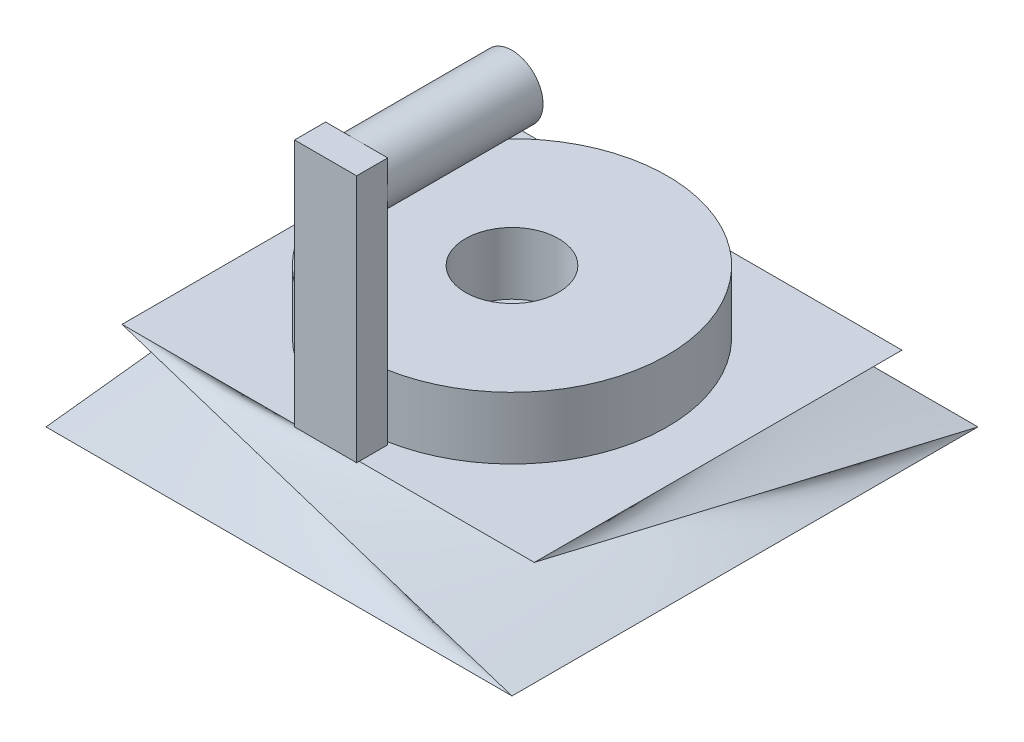
ISO-10303-21;
HEADER;
FILE_DESCRIPTION(('STEP AP214'),'2;1');
FILE_NAME('part.step','',(''),(''),'','','');
FILE_SCHEMA(('AUTOMOTIVE_DESIGN { 1 0 10303 214 1 1 1 1 }'));
ENDSEC;
DATA;
#1=APPLICATION_CONTEXT('core data for automotive mechanical design processes');
#2=APPLICATION_PROTOCOL_DEFINITION('international standard','automotive_design',2000,#1);
#3=PRODUCT_CONTEXT('',#1,'mechanical');
#4=PRODUCT('Part','Part','',(#3));
#5=PRODUCT_RELATED_PRODUCT_CATEGORY('part','',(#4));
#6=PRODUCT_DEFINITION_FORMATION('','',#4);
#7=PRODUCT_DEFINITION_CONTEXT('part definition',#1,'design');
#8=PRODUCT_DEFINITION('design','',#6,#7);
#9=PRODUCT_DEFINITION_SHAPE('','',#8);
#10=(LENGTH_UNIT() NAMED_UNIT(*) SI_UNIT(.MILLI.,.METRE.));
#11=(NAMED_UNIT(*) PLANE_ANGLE_UNIT() SI_UNIT($,.RADIAN.));
#12=(NAMED_UNIT(*) SI_UNIT($,.STERADIAN.) SOLID_ANGLE_UNIT());
#13=UNCERTAINTY_MEASURE_WITH_UNIT(LENGTH_MEASURE(1.E-05),#10,'distance_accuracy_value','');
#14=(GEOMETRIC_REPRESENTATION_CONTEXT(3) GLOBAL_UNCERTAINTY_ASSIGNED_CONTEXT((#13)) GLOBAL_UNIT_ASSIGNED_CONTEXT((#10,
#11,#12)) REPRESENTATION_CONTEXT('',''));
#15=CARTESIAN_POINT('',(0.,0.,0.));
#16=DIRECTION('',(0.,0.,1.));
#17=DIRECTION('',(1.,0.,0.));
#18=AXIS2_PLACEMENT_3D('',#15,#16,#17);
#19=CARTESIAN_POINT('',(0.,0.,50.));
#20=DIRECTION('',(0.,0.,1.));
#21=DIRECTION('',(1.,0.,0.));
#22=AXIS2_PLACEMENT_3D('',#19,#20,#21);
#23=PLANE('',#22);
#24=CARTESIAN_POINT('',(0.,70.,50.));
#25=DIRECTION('',(0.,0.,-1.));
#26=DIRECTION('',(-1.,0.,0.));
#27=AXIS2_PLACEMENT_3D('',#24,#25,#26);
#28=CIRCLE('',#27,10.);
#29=CARTESIAN_POINT('',(-10.,70.,50.));
#30=VERTEX_POINT('',#29);
#31=CARTESIAN_POINT('',(0.,80.,50.));
#32=VERTEX_POINT('',#31);
#33=EDGE_CURVE('E76',#30,#32,#28,.T.);
#34=ORIENTED_EDGE('',*,*,#33,.F.);
#35=DIRECTION('',(0.,-1.,0.));
#36=VECTOR('',#35,1.);
#37=CARTESIAN_POINT('',(-10.,80.,50.));
#38=LINE('',#37,#36);
#39=CARTESIAN_POINT('',(-10.,80.,50.));
#40=VERTEX_POINT('',#39);
#41=EDGE_CURVE('E118',#40,#30,#38,.T.);
#42=ORIENTED_EDGE('',*,*,#41,.F.);
#43=DIRECTION('',(-1.,0.,0.));
#44=VECTOR('',#43,1.);
#45=CARTESIAN_POINT('',(-10.,80.,50.));
#46=LINE('',#45,#44);
#47=EDGE_CURVE('E134',#32,#40,#46,.T.);
#48=ORIENTED_EDGE('',*,*,#47,.F.);
#49=EDGE_LOOP('',(#34,#42,#48));
#50=FACE_BOUND('',#49,.T.);
#51=ADVANCED_FACE('F65',(#50),#23,.F.);
#52=CARTESIAN_POINT('',(9.99999999999999,70.,50.));
#53=VERTEX_POINT('',#52);
#54=EDGE_CURVE('E13',#32,#53,#28,.T.);
#55=ORIENTED_EDGE('',*,*,#54,.F.);
#56=CARTESIAN_POINT('',(10.,80.,50.));
#57=VERTEX_POINT('',#56);
#58=EDGE_CURVE('E132',#57,#32,#46,.T.);
#59=ORIENTED_EDGE('',*,*,#58,.F.);
#60=DIRECTION('',(0.,1.,0.));
#61=VECTOR('',#60,1.);
#62=CARTESIAN_POINT('',(10.,80.,50.));
#63=LINE('',#62,#61);
#64=EDGE_CURVE('E155',#53,#57,#63,.T.);
#65=ORIENTED_EDGE('',*,*,#64,.F.);
#66=EDGE_LOOP('',(#55,#59,#65));
#67=FACE_BOUND('',#66,.T.);
#68=ADVANCED_FACE('F171',(#67),#23,.F.);
#69=CARTESIAN_POINT('',(10.,80.,60.));
#70=DIRECTION('',(-1.,0.,0.));
#71=DIRECTION('',(0.,-1.,0.));
#72=AXIS2_PLACEMENT_3D('',#69,#70,#71);
#73=PLANE('',#72);
#74=CARTESIAN_POINT('',(9.99999999999999,0.,50.));
#75=VERTEX_POINT('',#74);
#76=EDGE_CURVE('E152',#75,#53,#63,.T.);
#77=ORIENTED_EDGE('',*,*,#76,.T.);
#78=ORIENTED_EDGE('',*,*,#64,.T.);
#79=DIRECTION('',(0.,0.,-1.));
#80=VECTOR('',#79,1.);
#81=CARTESIAN_POINT('',(10.,80.,60.));
#82=LINE('',#81,#80);
#83=CARTESIAN_POINT('',(10.,80.,60.));
#84=VERTEX_POINT('',#83);
#85=EDGE_CURVE('E69',#84,#57,#82,.T.);
#86=ORIENTED_EDGE('',*,*,#85,.F.);
#87=DIRECTION('',(0.,1.,0.));
#88=VECTOR('',#87,1.);
#89=CARTESIAN_POINT('',(10.,80.,60.));
#90=LINE('',#89,#88);
#91=CARTESIAN_POINT('',(9.99999999999999,0.,60.));
#92=VERTEX_POINT('',#91);
#93=EDGE_CURVE('E142',#92,#84,#90,.T.);
#94=ORIENTED_EDGE('',*,*,#93,.F.);
#95=DIRECTION('',(0.,0.,-1.));
#96=VECTOR('',#95,1.);
#97=CARTESIAN_POINT('',(9.99999999999999,0.,60.));
#98=LINE('',#97,#96);
#99=EDGE_CURVE('E151',#92,#75,#98,.T.);
#100=ORIENTED_EDGE('',*,*,#99,.T.);
#101=EDGE_LOOP('',(#77,#78,#86,#94,#100));
#102=FACE_BOUND('',#101,.T.);
#103=ADVANCED_FACE('F67',(#102),#73,.F.);
#104=CARTESIAN_POINT('',(-10.,80.,60.));
#105=DIRECTION('',(0.,-1.,0.));
#106=DIRECTION('',(0.,0.,-1.));
#107=AXIS2_PLACEMENT_3D('',#104,#105,#106);
#108=PLANE('',#107);
#109=ORIENTED_EDGE('',*,*,#58,.T.);
#110=ORIENTED_EDGE('',*,*,#47,.T.);
#111=DIRECTION('',(0.,0.,-1.));
#112=VECTOR('',#111,1.);
#113=CARTESIAN_POINT('',(-10.,80.,60.));
#114=LINE('',#113,#112);
#115=CARTESIAN_POINT('',(-10.,80.,60.));
#116=VERTEX_POINT('',#115);
#117=EDGE_CURVE('E125',#116,#40,#114,.T.);
#118=ORIENTED_EDGE('',*,*,#117,.F.);
#119=DIRECTION('',(-1.,0.,0.));
#120=VECTOR('',#119,1.);
#121=CARTESIAN_POINT('',(-10.,80.,60.));
#122=LINE('',#121,#120);
#123=EDGE_CURVE('E145',#84,#116,#122,.T.);
#124=ORIENTED_EDGE('',*,*,#123,.F.);
#125=ORIENTED_EDGE('',*,*,#85,.T.);
#126=EDGE_LOOP('',(#109,#110,#118,#124,#125));
#127=FACE_BOUND('',#126,.T.);
#128=ADVANCED_FACE('F170',(#127),#108,.F.);
#129=CARTESIAN_POINT('',(-10.,80.,60.));
#130=DIRECTION('',(1.,0.,0.));
#131=DIRECTION('',(0.,1.,0.));
#132=AXIS2_PLACEMENT_3D('',#129,#130,#131);
#133=PLANE('',#132);
#134=ORIENTED_EDGE('',*,*,#41,.T.);
#135=CARTESIAN_POINT('',(-10.,0.,50.));
#136=VERTEX_POINT('',#135);
#137=EDGE_CURVE('E121',#30,#136,#38,.T.);
#138=ORIENTED_EDGE('',*,*,#137,.T.);
#139=DIRECTION('',(0.,0.,-1.));
#140=VECTOR('',#139,1.);
#141=CARTESIAN_POINT('',(-10.,0.,60.));
#142=LINE('',#141,#140);
#143=CARTESIAN_POINT('',(-10.,0.,60.));
#144=VERTEX_POINT('',#143);
#145=EDGE_CURVE('E160',#144,#136,#142,.T.);
#146=ORIENTED_EDGE('',*,*,#145,.F.);
#147=DIRECTION('',(0.,-1.,0.));
#148=VECTOR('',#147,1.);
#149=CARTESIAN_POINT('',(-10.,80.,60.));
#150=LINE('',#149,#148);
#151=EDGE_CURVE('E147',#116,#144,#150,.T.);
#152=ORIENTED_EDGE('',*,*,#151,.F.);
#153=ORIENTED_EDGE('',*,*,#117,.T.);
#154=EDGE_LOOP('',(#134,#138,#146,#152,#153));
#155=FACE_BOUND('',#154,.T.);
#156=ADVANCED_FACE('F119',(#155),#133,.F.);
#157=CARTESIAN_POINT('',(-10.,0.,60.));
#158=DIRECTION('',(0.,1.,0.));
#159=DIRECTION('',(0.,0.,1.));
#160=AXIS2_PLACEMENT_3D('',#157,#158,#159);
#161=PLANE('',#160);
#162=DIRECTION('',(1.,0.,0.));
#163=VECTOR('',#162,1.);
#164=CARTESIAN_POINT('',(-10.,0.,50.));
#165=LINE('',#164,#163);
#166=EDGE_CURVE('E128',#136,#75,#165,.T.);
#167=ORIENTED_EDGE('',*,*,#166,.T.);
#168=ORIENTED_EDGE('',*,*,#99,.F.);
#169=DIRECTION('',(1.,0.,0.));
#170=VECTOR('',#169,1.);
#171=CARTESIAN_POINT('',(-10.,0.,60.));
#172=LINE('',#171,#170);
#173=EDGE_CURVE('E149',#144,#92,#172,.T.);
#174=ORIENTED_EDGE('',*,*,#173,.F.);
#175=ORIENTED_EDGE('',*,*,#145,.T.);
#176=EDGE_LOOP('',(#167,#168,#174,#175));
#177=FACE_BOUND('',#176,.T.);
#178=ADVANCED_FACE('F163',(#177),#161,.F.);
#179=CARTESIAN_POINT('',(0.,0.,60.));
#180=DIRECTION('',(0.,0.,1.));
#181=DIRECTION('',(1.,0.,0.));
#182=AXIS2_PLACEMENT_3D('',#179,#180,#181);
#183=PLANE('',#182);
#184=ORIENTED_EDGE('',*,*,#93,.T.);
#185=ORIENTED_EDGE('',*,*,#123,.T.);
#186=ORIENTED_EDGE('',*,*,#151,.T.);
#187=ORIENTED_EDGE('',*,*,#173,.T.);
#188=EDGE_LOOP('',(#184,#185,#186,#187));
#189=FACE_BOUND('',#188,.T.);
#190=ADVANCED_FACE('F166',(#189),#183,.T.);
#191=EDGE_CURVE('E74',#53,#30,#28,.T.);
#192=ORIENTED_EDGE('',*,*,#191,.F.);
#193=ORIENTED_EDGE('',*,*,#76,.F.);
#194=ORIENTED_EDGE('',*,*,#166,.F.);
#195=ORIENTED_EDGE('',*,*,#137,.F.);
#196=EDGE_LOOP('',(#192,#193,#194,#195));
#197=FACE_BOUND('',#196,.T.);
#198=ADVANCED_FACE('F131',(#197),#23,.F.);
#199=CARTESIAN_POINT('',(0.,70.,0.));
#200=DIRECTION('',(0.,0.,1.));
#201=DIRECTION('',(1.,0.,0.));
#202=AXIS2_PLACEMENT_3D('',#199,#200,#201);
#203=CYLINDRICAL_SURFACE('',#202,10.);
#204=CARTESIAN_POINT('',(0.,70.,0.));
#205=DIRECTION('',(0.,0.,-1.));
#206=DIRECTION('',(-1.,0.,0.));
#207=AXIS2_PLACEMENT_3D('',#204,#205,#206);
#208=CIRCLE('',#207,10.);
#209=CARTESIAN_POINT('',(-10.,70.,0.));
#210=VERTEX_POINT('',#209);
#211=EDGE_CURVE('E137',#210,#210,#208,.T.);
#212=ORIENTED_EDGE('',*,*,#211,.F.);
#213=EDGE_LOOP('',(#212));
#214=FACE_BOUND('',#213,.T.);
#215=ORIENTED_EDGE('',*,*,#33,.T.);
#216=ORIENTED_EDGE('',*,*,#54,.T.);
#217=ORIENTED_EDGE('',*,*,#191,.T.);
#218=EDGE_LOOP('',(#215,#216,#217));
#219=FACE_BOUND('',#218,.T.);
#220=ADVANCED_FACE('F138',(#214,#219),#203,.T.);
#221=CARTESIAN_POINT('',(0.,70.,0.));
#222=DIRECTION('',(0.,0.,-1.));
#223=DIRECTION('',(-1.,0.,0.));
#224=AXIS2_PLACEMENT_3D('',#221,#222,#223);
#225=PLANE('',#224);
#226=ORIENTED_EDGE('',*,*,#211,.T.);
#227=EDGE_LOOP('',(#226));
#228=FACE_BOUND('',#227,.T.);
#229=ADVANCED_FACE('F190',(#228),#225,.T.);
#230=CLOSED_SHELL('',(#51,#68,#103,#128,#156,#178,#190,#198,#220,#229));
#231=MANIFOLD_SOLID_BREP('B2',#230);
#232=CARTESIAN_POINT('',(0.,20.,0.));
#233=DIRECTION('',(0.,1.,0.));
#234=DIRECTION('',(0.,0.,1.));
#235=AXIS2_PLACEMENT_3D('',#232,#233,#234);
#236=PLANE('',#235);
#237=CARTESIAN_POINT('',(0.,20.,0.));
#238=DIRECTION('',(0.,1.,0.));
#239=DIRECTION('',(0.,0.,1.));
#240=AXIS2_PLACEMENT_3D('',#237,#238,#239);
#241=CIRCLE('',#240,50.);
#242=CARTESIAN_POINT('',(0.,20.,50.));
#243=VERTEX_POINT('',#242);
#244=EDGE_CURVE('E63',#243,#243,#241,.T.);
#245=ORIENTED_EDGE('',*,*,#244,.T.);
#246=EDGE_LOOP('',(#245));
#247=FACE_BOUND('',#246,.T.);
#248=CARTESIAN_POINT('',(0.,20.,0.));
#249=DIRECTION('',(0.,1.,0.));
#250=DIRECTION('',(0.,0.,1.));
#251=AXIS2_PLACEMENT_3D('',#248,#249,#250);
#252=CIRCLE('',#251,15.);
#253=CARTESIAN_POINT('',(0.,20.,15.));
#254=VERTEX_POINT('',#253);
#255=EDGE_CURVE('E266',#254,#254,#252,.T.);
#256=ORIENTED_EDGE('',*,*,#255,.F.);
#257=EDGE_LOOP('',(#256));
#258=FACE_BOUND('',#257,.T.);
#259=ADVANCED_FACE('F256',(#247,#258),#236,.T.);
#260=CARTESIAN_POINT('',(0.,20.,0.));
#261=DIRECTION('',(0.,-1.,0.));
#262=DIRECTION('',(0.,0.,-1.));
#263=AXIS2_PLACEMENT_3D('',#260,#261,#262);
#264=CYLINDRICAL_SURFACE('',#263,50.);
#265=ORIENTED_EDGE('',*,*,#244,.F.);
#266=EDGE_LOOP('',(#265));
#267=FACE_BOUND('',#266,.T.);
#268=CARTESIAN_POINT('',(0.,0.,0.));
#269=DIRECTION('',(0.,1.,0.));
#270=DIRECTION('',(0.,0.,1.));
#271=AXIS2_PLACEMENT_3D('',#268,#269,#270);
#272=CIRCLE('',#271,50.);
#273=CARTESIAN_POINT('',(0.,0.,50.));
#274=VERTEX_POINT('',#273);
#275=EDGE_CURVE('E341',#274,#274,#272,.T.);
#276=ORIENTED_EDGE('',*,*,#275,.T.);
#277=EDGE_LOOP('',(#276));
#278=FACE_BOUND('',#277,.T.);
#279=ADVANCED_FACE('F258',(#267,#278),#264,.T.);
#280=CARTESIAN_POINT('',(0.,20.,0.));
#281=DIRECTION('',(0.,-1.,0.));
#282=DIRECTION('',(0.,0.,-1.));
#283=AXIS2_PLACEMENT_3D('',#280,#281,#282);
#284=CYLINDRICAL_SURFACE('',#283,15.);
#285=ORIENTED_EDGE('',*,*,#255,.T.);
#286=EDGE_LOOP('',(#285));
#287=FACE_BOUND('',#286,.T.);
#288=CARTESIAN_POINT('',(0.,0.,0.));
#289=DIRECTION('',(0.,1.,0.));
#290=DIRECTION('',(0.,0.,1.));
#291=AXIS2_PLACEMENT_3D('',#288,#289,#290);
#292=CIRCLE('',#291,15.);
#293=CARTESIAN_POINT('',(0.,0.,15.));
#294=VERTEX_POINT('',#293);
#295=EDGE_CURVE('E344',#294,#294,#292,.T.);
#296=ORIENTED_EDGE('',*,*,#295,.F.);
#297=EDGE_LOOP('',(#296));
#298=FACE_BOUND('',#297,.T.);
#299=ADVANCED_FACE('F373',(#287,#298),#284,.F.);
#300=CARTESIAN_POINT('',(0.,0.,0.));
#301=DIRECTION('',(0.,-1.,0.));
#302=DIRECTION('',(0.,0.,-1.));
#303=AXIS2_PLACEMENT_3D('',#300,#301,#302);
#304=PLANE('',#303);
#305=ORIENTED_EDGE('',*,*,#295,.T.);
#306=EDGE_LOOP('',(#305));
#307=FACE_BOUND('',#306,.T.);
#308=ADVANCED_FACE('F367',(#307),#304,.F.);
#309=CARTESIAN_POINT('',(0.,-25.,0.));
#310=DIRECTION('',(0.,-1.,0.));
#311=DIRECTION('',(0.,0.,-1.));
#312=AXIS2_PLACEMENT_3D('',#309,#310,#311);
#313=PLANE('',#312);
#314=DIRECTION('',(0.,0.,-1.));
#315=VECTOR('',#314,1.);
#316=CARTESIAN_POINT('',(-75.,-25.,-75.));
#317=LINE('',#316,#315);
#318=CARTESIAN_POINT('',(-75.,-25.,75.));
#319=VERTEX_POINT('',#318);
#320=CARTESIAN_POINT('',(-75.,-25.,-75.));
#321=VERTEX_POINT('',#320);
#322=EDGE_CURVE('E398',#319,#321,#317,.T.);
#323=ORIENTED_EDGE('',*,*,#322,.T.);
#324=DIRECTION('',(1.,0.,0.));
#325=VECTOR('',#324,1.);
#326=CARTESIAN_POINT('',(75.,-25.,-75.));
#327=LINE('',#326,#325);
#328=CARTESIAN_POINT('',(75.,-25.,-75.));
#329=VERTEX_POINT('',#328);
#330=EDGE_CURVE('E281',#321,#329,#327,.T.);
#331=ORIENTED_EDGE('',*,*,#330,.T.);
#332=DIRECTION('',(0.,0.,1.));
#333=VECTOR('',#332,1.);
#334=CARTESIAN_POINT('',(75.,-25.,-75.));
#335=LINE('',#334,#333);
#336=CARTESIAN_POINT('',(75.,-25.,75.));
#337=VERTEX_POINT('',#336);
#338=EDGE_CURVE('E397',#329,#337,#335,.T.);
#339=ORIENTED_EDGE('',*,*,#338,.T.);
#340=DIRECTION('',(-1.,0.,0.));
#341=VECTOR('',#340,1.);
#342=CARTESIAN_POINT('',(75.,-25.,75.));
#343=LINE('',#342,#341);
#344=EDGE_CURVE('E309',#337,#319,#343,.T.);
#345=ORIENTED_EDGE('',*,*,#344,.T.);
#346=EDGE_LOOP('',(#323,#331,#339,#345));
#347=FACE_BOUND('',#346,.T.);
#348=ADVANCED_FACE('F357',(#347),#313,.T.);
#349=ORIENTED_EDGE('',*,*,#275,.F.);
#350=EDGE_LOOP('',(#349));
#351=FACE_BOUND('',#350,.T.);
#352=DIRECTION('',(0.,0.,1.));
#353=VECTOR('',#352,1.);
#354=CARTESIAN_POINT('',(66.3611974817637,0.,59.1738871470531));
#355=LINE('',#354,#353);
#356=CARTESIAN_POINT('',(66.3611974817637,0.,-59.1738871470531));
#357=VERTEX_POINT('',#356);
#358=CARTESIAN_POINT('',(66.3611974817637,0.,59.1738871470531));
#359=VERTEX_POINT('',#358);
#360=EDGE_CURVE('E330',#357,#359,#355,.T.);
#361=ORIENTED_EDGE('',*,*,#360,.F.);
#362=DIRECTION('',(1.,0.,0.));
#363=VECTOR('',#362,1.);
#364=CARTESIAN_POINT('',(-66.3611974817637,0.,-59.1738871470531));
#365=LINE('',#364,#363);
#366=CARTESIAN_POINT('',(-66.3611974817637,0.,-59.1738871470531));
#367=VERTEX_POINT('',#366);
#368=EDGE_CURVE('E326',#367,#357,#365,.T.);
#369=ORIENTED_EDGE('',*,*,#368,.F.);
#370=DIRECTION('',(0.,0.,-1.));
#371=VECTOR('',#370,1.);
#372=CARTESIAN_POINT('',(-66.3611974817637,0.,59.1738871470531));
#373=LINE('',#372,#371);
#374=CARTESIAN_POINT('',(-66.3611974817637,0.,59.1738871470531));
#375=VERTEX_POINT('',#374);
#376=EDGE_CURVE('E307',#375,#367,#373,.T.);
#377=ORIENTED_EDGE('',*,*,#376,.F.);
#378=DIRECTION('',(-1.,0.,0.));
#379=VECTOR('',#378,1.);
#380=CARTESIAN_POINT('',(-66.3611974817637,0.,59.1738871470531));
#381=LINE('',#380,#379);
#382=EDGE_CURVE('E317',#359,#375,#381,.T.);
#383=ORIENTED_EDGE('',*,*,#382,.F.);
#384=EDGE_LOOP('',(#361,#369,#377,#383));
#385=FACE_BOUND('',#384,.T.);
#386=ADVANCED_FACE('F325',(#351,#385),#304,.F.);
#387=CARTESIAN_POINT('',(66.3611974817637,0.,59.1738871470531));
#388=CARTESIAN_POINT('',(75.,-25.,-75.));
#389=CARTESIAN_POINT('',(44.2407983211758,0.,59.1738871470531));
#390=CARTESIAN_POINT('',(75.,-25.,-50.));
#391=CARTESIAN_POINT('',(22.1203991605879,0.,59.1738871470531));
#392=CARTESIAN_POINT('',(75.,-25.,-25.));
#393=CARTESIAN_POINT('',(-22.1203991605879,0.,59.1738871470531));
#394=CARTESIAN_POINT('',(75.,-25.,25.));
#395=CARTESIAN_POINT('',(-44.2407983211758,0.,59.1738871470531));
#396=CARTESIAN_POINT('',(75.,-25.,50.));
#397=CARTESIAN_POINT('',(-66.3611974817637,0.,59.1738871470531));
#398=CARTESIAN_POINT('',(75.,-25.,75.));
#399=B_SPLINE_SURFACE_WITH_KNOTS('',3,1,((#387,#388),(#389,#390),(#391,#392),(#393,#394),(#395,
#396),(#397,#398)),.UNSPECIFIED.,.F.,.F.,.F.,(4,2,4),(2,2),(0.,0.5,1.),(0.,1.),.UNSPECIFIED.);
#400=DIRECTION('',(0.97878917469473,-0.173100750441258,0.109580480456526));
#401=VECTOR('',#400,1.);
#402=CARTESIAN_POINT('',(4.31940125911814,-12.5,67.0869435735265));
#403=LINE('',#402,#401);
#404=EDGE_CURVE('E302',#375,#337,#403,.T.);
#405=DIRECTION('',(-0.0631693619980584,0.182807055331771,0.981117328470803));
#406=VECTOR('',#405,1.);
#407=CARTESIAN_POINT('',(70.6805987408819,-12.5,-7.91305642647346));
#408=LINE('',#407,#406);
#409=EDGE_CURVE('E314',#329,#359,#408,.T.);
#410=ORIENTED_EDGE('',*,*,#382,.T.);
#411=ORIENTED_EDGE('',*,*,#404,.T.);
#412=ORIENTED_EDGE('',*,*,#338,.F.);
#413=ORIENTED_EDGE('',*,*,#409,.T.);
#414=EDGE_LOOP('',(#410,#411,#412,#413));
#415=FACE_BOUND('',#414,.T.);
#416=ADVANCED_FACE('F318',(#415),#399,.T.);
#417=CARTESIAN_POINT('',(-66.3611974817637,0.,59.1738871470531));
#418=CARTESIAN_POINT('',(75.,-25.,75.));
#419=CARTESIAN_POINT('',(-66.3611974817637,0.,39.4492580980353));
#420=CARTESIAN_POINT('',(50.,-25.,75.));
#421=CARTESIAN_POINT('',(-66.3611974817637,0.,19.7246290490176));
#422=CARTESIAN_POINT('',(25.,-25.,75.));
#423=CARTESIAN_POINT('',(-66.3611974817637,0.,-19.7246290490178));
#424=CARTESIAN_POINT('',(-25.,-25.,75.));
#425=CARTESIAN_POINT('',(-66.3611974817637,0.,-39.4492580980354));
#426=CARTESIAN_POINT('',(-50.,-25.,75.));
#427=CARTESIAN_POINT('',(-66.3611974817637,0.,-59.1738871470531));
#428=CARTESIAN_POINT('',(-75.,-25.,75.));
#429=B_SPLINE_SURFACE_WITH_KNOTS('',3,1,((#417,#418),(#419,#420),(#421,#422),(#423,#424),(#425,
#426),(#427,#428)),.UNSPECIFIED.,.F.,.F.,.F.,(4,2,4),(2,2),(0.,0.5,1.),(0.,1.),.UNSPECIFIED.);
#430=DIRECTION('',(-0.0631693619980583,-0.182807055331771,0.981117328470803));
#431=VECTOR('',#430,1.);
#432=CARTESIAN_POINT('',(-70.6805987408819,-12.5,7.91305642647346));
#433=LINE('',#432,#431);
#434=EDGE_CURVE('E313',#367,#319,#433,.T.);
#435=ORIENTED_EDGE('',*,*,#376,.T.);
#436=ORIENTED_EDGE('',*,*,#434,.T.);
#437=ORIENTED_EDGE('',*,*,#344,.F.);
#438=ORIENTED_EDGE('',*,*,#404,.F.);
#439=EDGE_LOOP('',(#435,#436,#437,#438));
#440=FACE_BOUND('',#439,.T.);
#441=ADVANCED_FACE('F304',(#440),#429,.T.);
#442=CARTESIAN_POINT('',(66.3611974817637,0.,-59.1738871470531));
#443=CARTESIAN_POINT('',(-75.,-25.,-75.));
#444=CARTESIAN_POINT('',(66.3611974817637,0.,-39.4492580980353));
#445=CARTESIAN_POINT('',(-50.,-25.,-75.));
#446=CARTESIAN_POINT('',(66.3611974817637,0.,-19.7246290490176));
#447=CARTESIAN_POINT('',(-25.,-25.,-75.));
#448=CARTESIAN_POINT('',(66.3611974817637,0.,19.7246290490178));
#449=CARTESIAN_POINT('',(25.,-25.,-75.));
#450=CARTESIAN_POINT('',(66.3611974817637,0.,39.4492580980354));
#451=CARTESIAN_POINT('',(50.,-25.,-75.));
#452=CARTESIAN_POINT('',(66.3611974817637,0.,59.1738871470531));
#453=CARTESIAN_POINT('',(75.,-25.,-75.));
#454=B_SPLINE_SURFACE_WITH_KNOTS('',3,1,((#442,#443),(#444,#445),(#446,#447),(#448,#449),(#450,
#451),(#452,#453)),.UNSPECIFIED.,.F.,.F.,.F.,(4,2,4),(2,2),(0.,0.5,1.),(0.,1.),.UNSPECIFIED.);
#455=DIRECTION('',(-0.97878917469473,-0.173100750441259,-0.109580480456526));
#456=VECTOR('',#455,1.);
#457=CARTESIAN_POINT('',(-4.31940125911812,-12.5,-67.0869435735265));
#458=LINE('',#457,#456);
#459=EDGE_CURVE('E274',#357,#321,#458,.T.);
#460=ORIENTED_EDGE('',*,*,#360,.T.);
#461=ORIENTED_EDGE('',*,*,#409,.F.);
#462=ORIENTED_EDGE('',*,*,#330,.F.);
#463=ORIENTED_EDGE('',*,*,#459,.F.);
#464=EDGE_LOOP('',(#460,#461,#462,#463));
#465=FACE_BOUND('',#464,.T.);
#466=ADVANCED_FACE('F429',(#465),#454,.T.);
#467=CARTESIAN_POINT('',(-66.3611974817637,0.,-59.1738871470531));
#468=CARTESIAN_POINT('',(-75.,-25.,75.));
#469=CARTESIAN_POINT('',(-44.2407983211758,0.,-59.1738871470531));
#470=CARTESIAN_POINT('',(-75.,-25.,50.));
#471=CARTESIAN_POINT('',(-22.1203991605879,0.,-59.1738871470531));
#472=CARTESIAN_POINT('',(-75.,-25.,25.));
#473=CARTESIAN_POINT('',(22.1203991605879,0.,-59.1738871470531));
#474=CARTESIAN_POINT('',(-75.,-25.,-25.));
#475=CARTESIAN_POINT('',(44.2407983211758,0.,-59.1738871470531));
#476=CARTESIAN_POINT('',(-75.,-25.,-50.));
#477=CARTESIAN_POINT('',(66.3611974817637,0.,-59.1738871470531));
#478=CARTESIAN_POINT('',(-75.,-25.,-75.));
#479=B_SPLINE_SURFACE_WITH_KNOTS('',3,1,((#467,#468),(#469,#470),(#471,#472),(#473,#474),(#475,
#476),(#477,#478)),.UNSPECIFIED.,.F.,.F.,.F.,(4,2,4),(2,2),(0.,0.5,1.),(0.,1.),.UNSPECIFIED.);
#480=ORIENTED_EDGE('',*,*,#368,.T.);
#481=ORIENTED_EDGE('',*,*,#459,.T.);
#482=ORIENTED_EDGE('',*,*,#322,.F.);
#483=ORIENTED_EDGE('',*,*,#434,.F.);
#484=EDGE_LOOP('',(#480,#481,#482,#483));
#485=FACE_BOUND('',#484,.T.);
#486=ADVANCED_FACE('F368',(#485),#479,.T.);
#487=CLOSED_SHELL('',(#259,#279,#299,#308,#348,#386,#416,#441,#466,#486));
#488=MANIFOLD_SOLID_BREP('B7',#487);
#489=ADVANCED_BREP_SHAPE_REPRESENTATION('',(#18,#231,#488),#14);
#490=SHAPE_DEFINITION_REPRESENTATION(#9,#489);
ENDSEC;
END-ISO-10303-21;
